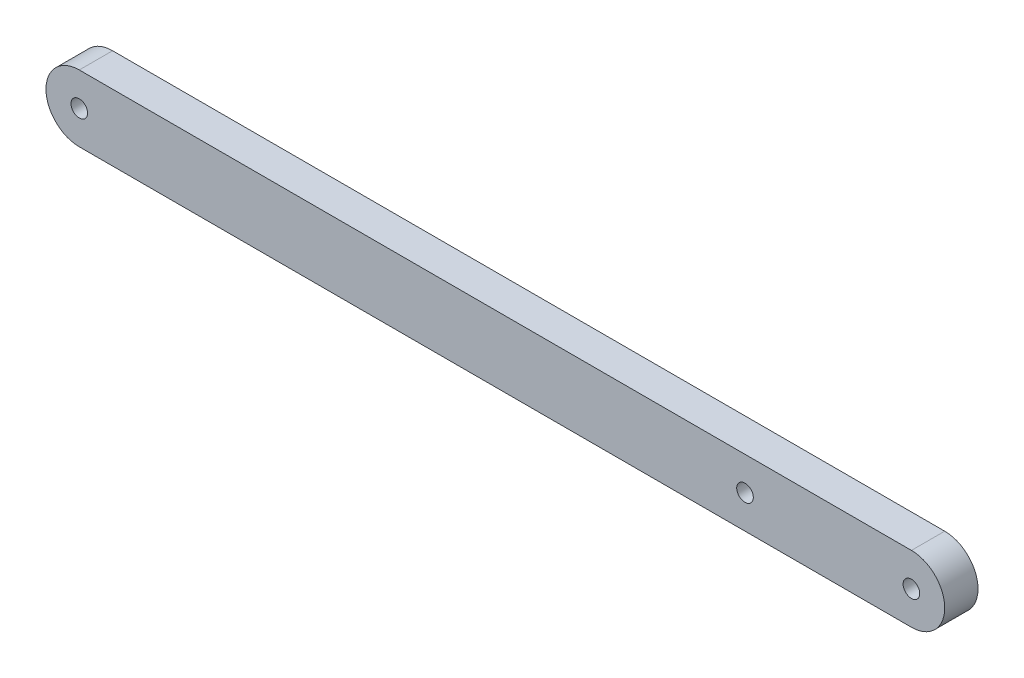
ISO-10303-21;
HEADER;
FILE_DESCRIPTION(('STEP AP214'),'2;1');
FILE_NAME('part.step','',(''),(''),'','','');
FILE_SCHEMA(('AUTOMOTIVE_DESIGN { 1 0 10303 214 1 1 1 1 }'));
ENDSEC;
DATA;
#1=APPLICATION_CONTEXT('core data for automotive mechanical design processes');
#2=APPLICATION_PROTOCOL_DEFINITION('international standard','automotive_design',2000,#1);
#3=PRODUCT_CONTEXT('',#1,'mechanical');
#4=PRODUCT('Part','Part','',(#3));
#5=PRODUCT_RELATED_PRODUCT_CATEGORY('part','',(#4));
#6=PRODUCT_DEFINITION_FORMATION('','',#4);
#7=PRODUCT_DEFINITION_CONTEXT('part definition',#1,'design');
#8=PRODUCT_DEFINITION('design','',#6,#7);
#9=PRODUCT_DEFINITION_SHAPE('','',#8);
#10=(LENGTH_UNIT() NAMED_UNIT(*) SI_UNIT(.MILLI.,.METRE.));
#11=(NAMED_UNIT(*) PLANE_ANGLE_UNIT() SI_UNIT($,.RADIAN.));
#12=(NAMED_UNIT(*) SI_UNIT($,.STERADIAN.) SOLID_ANGLE_UNIT());
#13=UNCERTAINTY_MEASURE_WITH_UNIT(LENGTH_MEASURE(1.E-05),#10,'distance_accuracy_value','');
#14=(GEOMETRIC_REPRESENTATION_CONTEXT(3) GLOBAL_UNCERTAINTY_ASSIGNED_CONTEXT((#13)) GLOBAL_UNIT_ASSIGNED_CONTEXT((#10,
#11,#12)) REPRESENTATION_CONTEXT('',''));
#15=CARTESIAN_POINT('',(0.,0.,0.));
#16=DIRECTION('',(0.,0.,1.));
#17=DIRECTION('',(1.,0.,0.));
#18=AXIS2_PLACEMENT_3D('',#15,#16,#17);
#19=CARTESIAN_POINT('',(50.,0.,10.));
#20=DIRECTION('',(0.,0.,-1.));
#21=DIRECTION('',(-1.,0.,0.));
#22=AXIS2_PLACEMENT_3D('',#19,#20,#21);
#23=PLANE('',#22);
#24=CARTESIAN_POINT('',(50.,0.,10.));
#25=DIRECTION('',(0.,0.,1.));
#26=DIRECTION('',(-1.,0.,0.));
#27=AXIS2_PLACEMENT_3D('',#24,#25,#26);
#28=CIRCLE('',#27,10.);
#29=CARTESIAN_POINT('',(50.,-10.,10.));
#30=VERTEX_POINT('',#29);
#31=CARTESIAN_POINT('',(50.,10.,10.));
#32=VERTEX_POINT('',#31);
#33=EDGE_CURVE('E86',#30,#32,#28,.T.);
#34=ORIENTED_EDGE('',*,*,#33,.T.);
#35=DIRECTION('',(-1.,0.,0.));
#36=VECTOR('',#35,1.);
#37=CARTESIAN_POINT('',(50.,10.,10.));
#38=LINE('',#37,#36);
#39=CARTESIAN_POINT('',(-200.,10.,10.));
#40=VERTEX_POINT('',#39);
#41=EDGE_CURVE('E81',#32,#40,#38,.T.);
#42=ORIENTED_EDGE('',*,*,#41,.T.);
#43=CARTESIAN_POINT('',(-200.,0.,10.));
#44=DIRECTION('',(0.,0.,1.));
#45=DIRECTION('',(1.,0.,0.));
#46=AXIS2_PLACEMENT_3D('',#43,#44,#45);
#47=CIRCLE('',#46,10.);
#48=CARTESIAN_POINT('',(-200.,-10.,10.));
#49=VERTEX_POINT('',#48);
#50=EDGE_CURVE('E84',#40,#49,#47,.T.);
#51=ORIENTED_EDGE('',*,*,#50,.T.);
#52=DIRECTION('',(1.,0.,0.));
#53=VECTOR('',#52,1.);
#54=CARTESIAN_POINT('',(50.,-10.,10.));
#55=LINE('',#54,#53);
#56=EDGE_CURVE('E51',#49,#30,#55,.T.);
#57=ORIENTED_EDGE('',*,*,#56,.T.);
#58=EDGE_LOOP('',(#34,#42,#51,#57));
#59=FACE_BOUND('',#58,.T.);
#60=CARTESIAN_POINT('',(0.,0.,10.));
#61=DIRECTION('',(0.,0.,1.));
#62=DIRECTION('',(1.,0.,0.));
#63=AXIS2_PLACEMENT_3D('',#60,#61,#62);
#64=CIRCLE('',#63,2.5);
#65=CARTESIAN_POINT('',(2.5,0.,10.));
#66=VERTEX_POINT('',#65);
#67=EDGE_CURVE('E101',#66,#66,#64,.T.);
#68=ORIENTED_EDGE('',*,*,#67,.F.);
#69=EDGE_LOOP('',(#68));
#70=FACE_BOUND('',#69,.T.);
#71=CARTESIAN_POINT('',(50.,0.,10.));
#72=DIRECTION('',(0.,0.,1.));
#73=DIRECTION('',(1.,0.,0.));
#74=AXIS2_PLACEMENT_3D('',#71,#72,#73);
#75=CIRCLE('',#74,2.5);
#76=CARTESIAN_POINT('',(52.5,0.,10.));
#77=VERTEX_POINT('',#76);
#78=EDGE_CURVE('E116',#77,#77,#75,.T.);
#79=ORIENTED_EDGE('',*,*,#78,.F.);
#80=EDGE_LOOP('',(#79));
#81=FACE_BOUND('',#80,.T.);
#82=CARTESIAN_POINT('',(-200.,0.,10.));
#83=DIRECTION('',(0.,0.,1.));
#84=DIRECTION('',(1.,0.,0.));
#85=AXIS2_PLACEMENT_3D('',#82,#83,#84);
#86=CIRCLE('',#85,2.5);
#87=CARTESIAN_POINT('',(-197.5,0.,10.));
#88=VERTEX_POINT('',#87);
#89=EDGE_CURVE('E122',#88,#88,#86,.T.);
#90=ORIENTED_EDGE('',*,*,#89,.F.);
#91=EDGE_LOOP('',(#90));
#92=FACE_BOUND('',#91,.T.);
#93=ADVANCED_FACE('F34',(#59,#70,#81,#92),#23,.F.);
#94=CARTESIAN_POINT('',(50.,0.,0.));
#95=DIRECTION('',(0.,0.,-1.));
#96=DIRECTION('',(-1.,0.,0.));
#97=AXIS2_PLACEMENT_3D('',#94,#95,#96);
#98=PLANE('',#97);
#99=CARTESIAN_POINT('',(50.,0.,0.));
#100=DIRECTION('',(0.,0.,1.));
#101=DIRECTION('',(1.,0.,0.));
#102=AXIS2_PLACEMENT_3D('',#99,#100,#101);
#103=CIRCLE('',#102,2.5);
#104=CARTESIAN_POINT('',(52.5,0.,0.));
#105=VERTEX_POINT('',#104);
#106=EDGE_CURVE('E119',#105,#105,#103,.T.);
#107=ORIENTED_EDGE('',*,*,#106,.T.);
#108=EDGE_LOOP('',(#107));
#109=FACE_BOUND('',#108,.T.);
#110=CARTESIAN_POINT('',(50.,0.,0.));
#111=DIRECTION('',(0.,0.,1.));
#112=DIRECTION('',(-1.,0.,0.));
#113=AXIS2_PLACEMENT_3D('',#110,#111,#112);
#114=CIRCLE('',#113,10.);
#115=CARTESIAN_POINT('',(50.,-10.,0.));
#116=VERTEX_POINT('',#115);
#117=CARTESIAN_POINT('',(50.,10.,0.));
#118=VERTEX_POINT('',#117);
#119=EDGE_CURVE('E98',#116,#118,#114,.T.);
#120=ORIENTED_EDGE('',*,*,#119,.F.);
#121=DIRECTION('',(1.,0.,0.));
#122=VECTOR('',#121,1.);
#123=CARTESIAN_POINT('',(50.,-10.,0.));
#124=LINE('',#123,#122);
#125=CARTESIAN_POINT('',(-200.,-10.,0.));
#126=VERTEX_POINT('',#125);
#127=EDGE_CURVE('E74',#126,#116,#124,.T.);
#128=ORIENTED_EDGE('',*,*,#127,.F.);
#129=CARTESIAN_POINT('',(-200.,0.,0.));
#130=DIRECTION('',(0.,0.,1.));
#131=DIRECTION('',(1.,0.,0.));
#132=AXIS2_PLACEMENT_3D('',#129,#130,#131);
#133=CIRCLE('',#132,10.);
#134=CARTESIAN_POINT('',(-200.,10.,0.));
#135=VERTEX_POINT('',#134);
#136=EDGE_CURVE('E68',#135,#126,#133,.T.);
#137=ORIENTED_EDGE('',*,*,#136,.F.);
#138=DIRECTION('',(-1.,0.,0.));
#139=VECTOR('',#138,1.);
#140=CARTESIAN_POINT('',(50.,10.,0.));
#141=LINE('',#140,#139);
#142=EDGE_CURVE('E90',#118,#135,#141,.T.);
#143=ORIENTED_EDGE('',*,*,#142,.F.);
#144=EDGE_LOOP('',(#120,#128,#137,#143));
#145=FACE_BOUND('',#144,.T.);
#146=CARTESIAN_POINT('',(0.,0.,0.));
#147=DIRECTION('',(0.,0.,1.));
#148=DIRECTION('',(1.,0.,0.));
#149=AXIS2_PLACEMENT_3D('',#146,#147,#148);
#150=CIRCLE('',#149,2.5);
#151=CARTESIAN_POINT('',(2.5,0.,0.));
#152=VERTEX_POINT('',#151);
#153=EDGE_CURVE('E113',#152,#152,#150,.T.);
#154=ORIENTED_EDGE('',*,*,#153,.T.);
#155=EDGE_LOOP('',(#154));
#156=FACE_BOUND('',#155,.T.);
#157=CARTESIAN_POINT('',(-200.,0.,0.));
#158=DIRECTION('',(0.,0.,1.));
#159=DIRECTION('',(1.,0.,0.));
#160=AXIS2_PLACEMENT_3D('',#157,#158,#159);
#161=CIRCLE('',#160,2.5);
#162=CARTESIAN_POINT('',(-197.5,0.,0.));
#163=VERTEX_POINT('',#162);
#164=EDGE_CURVE('E125',#163,#163,#161,.T.);
#165=ORIENTED_EDGE('',*,*,#164,.T.);
#166=EDGE_LOOP('',(#165));
#167=FACE_BOUND('',#166,.T.);
#168=ADVANCED_FACE('F109',(#109,#145,#156,#167),#98,.T.);
#169=CARTESIAN_POINT('',(50.,0.,10.));
#170=DIRECTION('',(0.,0.,-1.));
#171=DIRECTION('',(-1.,0.,0.));
#172=AXIS2_PLACEMENT_3D('',#169,#170,#171);
#173=CYLINDRICAL_SURFACE('',#172,10.);
#174=ORIENTED_EDGE('',*,*,#119,.T.);
#175=DIRECTION('',(0.,0.,-1.));
#176=VECTOR('',#175,1.);
#177=CARTESIAN_POINT('',(50.,10.,10.));
#178=LINE('',#177,#176);
#179=EDGE_CURVE('E11',#32,#118,#178,.T.);
#180=ORIENTED_EDGE('',*,*,#179,.F.);
#181=ORIENTED_EDGE('',*,*,#33,.F.);
#182=DIRECTION('',(0.,0.,-1.));
#183=VECTOR('',#182,1.);
#184=CARTESIAN_POINT('',(50.,-10.,10.));
#185=LINE('',#184,#183);
#186=EDGE_CURVE('E94',#30,#116,#185,.T.);
#187=ORIENTED_EDGE('',*,*,#186,.T.);
#188=EDGE_LOOP('',(#174,#180,#181,#187));
#189=FACE_BOUND('',#188,.T.);
#190=ADVANCED_FACE('F36',(#189),#173,.T.);
#191=CARTESIAN_POINT('',(50.,10.,10.));
#192=DIRECTION('',(0.,-1.,0.));
#193=DIRECTION('',(0.,0.,-1.));
#194=AXIS2_PLACEMENT_3D('',#191,#192,#193);
#195=PLANE('',#194);
#196=ORIENTED_EDGE('',*,*,#142,.T.);
#197=DIRECTION('',(0.,0.,-1.));
#198=VECTOR('',#197,1.);
#199=CARTESIAN_POINT('',(-200.,10.,10.));
#200=LINE('',#199,#198);
#201=EDGE_CURVE('E43',#40,#135,#200,.T.);
#202=ORIENTED_EDGE('',*,*,#201,.F.);
#203=ORIENTED_EDGE('',*,*,#41,.F.);
#204=ORIENTED_EDGE('',*,*,#179,.T.);
#205=EDGE_LOOP('',(#196,#202,#203,#204));
#206=FACE_BOUND('',#205,.T.);
#207=ADVANCED_FACE('F89',(#206),#195,.F.);
#208=CARTESIAN_POINT('',(-200.,0.,10.));
#209=DIRECTION('',(0.,0.,-1.));
#210=DIRECTION('',(-1.,0.,0.));
#211=AXIS2_PLACEMENT_3D('',#208,#209,#210);
#212=CYLINDRICAL_SURFACE('',#211,10.);
#213=ORIENTED_EDGE('',*,*,#136,.T.);
#214=DIRECTION('',(0.,0.,-1.));
#215=VECTOR('',#214,1.);
#216=CARTESIAN_POINT('',(-200.,-10.,10.));
#217=LINE('',#216,#215);
#218=EDGE_CURVE('E91',#49,#126,#217,.T.);
#219=ORIENTED_EDGE('',*,*,#218,.F.);
#220=ORIENTED_EDGE('',*,*,#50,.F.);
#221=ORIENTED_EDGE('',*,*,#201,.T.);
#222=EDGE_LOOP('',(#213,#219,#220,#221));
#223=FACE_BOUND('',#222,.T.);
#224=ADVANCED_FACE('F92',(#223),#212,.T.);
#225=CARTESIAN_POINT('',(50.,-10.,10.));
#226=DIRECTION('',(0.,1.,0.));
#227=DIRECTION('',(0.,0.,1.));
#228=AXIS2_PLACEMENT_3D('',#225,#226,#227);
#229=PLANE('',#228);
#230=ORIENTED_EDGE('',*,*,#127,.T.);
#231=ORIENTED_EDGE('',*,*,#186,.F.);
#232=ORIENTED_EDGE('',*,*,#56,.F.);
#233=ORIENTED_EDGE('',*,*,#218,.T.);
#234=EDGE_LOOP('',(#230,#231,#232,#233));
#235=FACE_BOUND('',#234,.T.);
#236=ADVANCED_FACE('F106',(#235),#229,.F.);
#237=CARTESIAN_POINT('',(0.,0.,10.));
#238=DIRECTION('',(0.,0.,-1.));
#239=DIRECTION('',(-1.,0.,0.));
#240=AXIS2_PLACEMENT_3D('',#237,#238,#239);
#241=CYLINDRICAL_SURFACE('',#240,2.5);
#242=ORIENTED_EDGE('',*,*,#67,.T.);
#243=EDGE_LOOP('',(#242));
#244=FACE_BOUND('',#243,.T.);
#245=ORIENTED_EDGE('',*,*,#153,.F.);
#246=EDGE_LOOP('',(#245));
#247=FACE_BOUND('',#246,.T.);
#248=ADVANCED_FACE('F142',(#244,#247),#241,.F.);
#249=CARTESIAN_POINT('',(50.,0.,10.));
#250=DIRECTION('',(0.,0.,-1.));
#251=DIRECTION('',(-1.,0.,0.));
#252=AXIS2_PLACEMENT_3D('',#249,#250,#251);
#253=CYLINDRICAL_SURFACE('',#252,2.5);
#254=ORIENTED_EDGE('',*,*,#78,.T.);
#255=EDGE_LOOP('',(#254));
#256=FACE_BOUND('',#255,.T.);
#257=ORIENTED_EDGE('',*,*,#106,.F.);
#258=EDGE_LOOP('',(#257));
#259=FACE_BOUND('',#258,.T.);
#260=ADVANCED_FACE('F188',(#256,#259),#253,.F.);
#261=CARTESIAN_POINT('',(-200.,0.,10.));
#262=DIRECTION('',(0.,0.,-1.));
#263=DIRECTION('',(-1.,0.,0.));
#264=AXIS2_PLACEMENT_3D('',#261,#262,#263);
#265=CYLINDRICAL_SURFACE('',#264,2.5);
#266=ORIENTED_EDGE('',*,*,#89,.T.);
#267=EDGE_LOOP('',(#266));
#268=FACE_BOUND('',#267,.T.);
#269=ORIENTED_EDGE('',*,*,#164,.F.);
#270=EDGE_LOOP('',(#269));
#271=FACE_BOUND('',#270,.T.);
#272=ADVANCED_FACE('F131',(#268,#271),#265,.F.);
#273=CLOSED_SHELL('',(#93,#168,#190,#207,#224,#236,#248,#260,#272));
#274=MANIFOLD_SOLID_BREP('B2',#273);
#275=ADVANCED_BREP_SHAPE_REPRESENTATION('',(#18,#274),#14);
#276=SHAPE_DEFINITION_REPRESENTATION(#9,#275);
ENDSEC;
END-ISO-10303-21;
